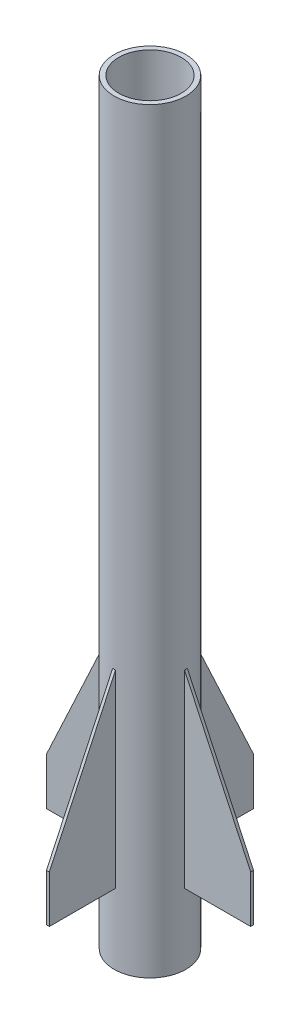
ISO-10303-21;
HEADER;
FILE_DESCRIPTION(('STEP AP214'),'2;1');
FILE_NAME('part.step','',(''),(''),'','','');
FILE_SCHEMA(('AUTOMOTIVE_DESIGN { 1 0 10303 214 1 1 1 1 }'));
ENDSEC;
DATA;
#1=APPLICATION_CONTEXT('core data for automotive mechanical design processes');
#2=APPLICATION_PROTOCOL_DEFINITION('international standard','automotive_design',2000,#1);
#3=PRODUCT_CONTEXT('',#1,'mechanical');
#4=PRODUCT('Part','Part','',(#3));
#5=PRODUCT_RELATED_PRODUCT_CATEGORY('part','',(#4));
#6=PRODUCT_DEFINITION_FORMATION('','',#4);
#7=PRODUCT_DEFINITION_CONTEXT('part definition',#1,'design');
#8=PRODUCT_DEFINITION('design','',#6,#7);
#9=PRODUCT_DEFINITION_SHAPE('','',#8);
#10=(LENGTH_UNIT() NAMED_UNIT(*) SI_UNIT(.MILLI.,.METRE.));
#11=(NAMED_UNIT(*) PLANE_ANGLE_UNIT() SI_UNIT($,.RADIAN.));
#12=(NAMED_UNIT(*) SI_UNIT($,.STERADIAN.) SOLID_ANGLE_UNIT());
#13=UNCERTAINTY_MEASURE_WITH_UNIT(LENGTH_MEASURE(1.E-05),#10,'distance_accuracy_value','');
#14=(GEOMETRIC_REPRESENTATION_CONTEXT(3) GLOBAL_UNCERTAINTY_ASSIGNED_CONTEXT((#13)) GLOBAL_UNIT_ASSIGNED_CONTEXT((#10,
#11,#12)) REPRESENTATION_CONTEXT('',''));
#15=CARTESIAN_POINT('',(0.,0.,0.));
#16=DIRECTION('',(0.,0.,1.));
#17=DIRECTION('',(1.,0.,0.));
#18=AXIS2_PLACEMENT_3D('',#15,#16,#17);
#19=CARTESIAN_POINT('',(2.99999999999774,150.,-216.));
#20=DIRECTION('',(0.,0.,1.));
#21=DIRECTION('',(1.,0.,0.));
#22=AXIS2_PLACEMENT_3D('',#19,#20,#21);
#23=PLANE('',#22);
#24=DIRECTION('',(-1.,0.,0.));
#25=VECTOR('',#24,1.);
#26=CARTESIAN_POINT('',(2.99999999999774,150.,-216.));
#27=LINE('',#26,#25);
#28=CARTESIAN_POINT('',(2.99999999999774,150.,-216.));
#29=VERTEX_POINT('',#28);
#30=CARTESIAN_POINT('',(-3.00000000000226,150.,-216.));
#31=VERTEX_POINT('',#30);
#32=EDGE_CURVE('E107',#29,#31,#27,.T.);
#33=ORIENTED_EDGE('',*,*,#32,.T.);
#34=DIRECTION('',(0.,1.,0.));
#35=VECTOR('',#34,1.);
#36=CARTESIAN_POINT('',(-3.00000000000226,150.,-216.));
#37=LINE('',#36,#35);
#38=CARTESIAN_POINT('',(-3.00000000000226,250.,-216.));
#39=VERTEX_POINT('',#38);
#40=EDGE_CURVE('E102',#31,#39,#37,.T.);
#41=ORIENTED_EDGE('',*,*,#40,.T.);
#42=DIRECTION('',(-1.,0.,0.));
#43=VECTOR('',#42,1.);
#44=CARTESIAN_POINT('',(2.99999999999774,250.,-216.));
#45=LINE('',#44,#43);
#46=CARTESIAN_POINT('',(2.99999999999774,250.,-216.));
#47=VERTEX_POINT('',#46);
#48=EDGE_CURVE('E12',#47,#39,#45,.T.);
#49=ORIENTED_EDGE('',*,*,#48,.F.);
#50=DIRECTION('',(0.,1.,0.));
#51=VECTOR('',#50,1.);
#52=CARTESIAN_POINT('',(2.99999999999774,150.,-216.));
#53=LINE('',#52,#51);
#54=EDGE_CURVE('E113',#29,#47,#53,.T.);
#55=ORIENTED_EDGE('',*,*,#54,.F.);
#56=EDGE_LOOP('',(#33,#41,#49,#55));
#57=FACE_BOUND('',#56,.T.);
#58=ADVANCED_FACE('F50',(#57),#23,.F.);
#59=CARTESIAN_POINT('',(2.99999999999774,250.,-216.));
#60=DIRECTION('',(0.,-0.422885465331124,0.906183139995265));
#61=DIRECTION('',(0.,0.906183139995265,0.422885465331124));
#62=AXIS2_PLACEMENT_3D('',#59,#60,#61);
#63=PLANE('',#62);
#64=ORIENTED_EDGE('',*,*,#48,.T.);
#65=DIRECTION('',(0.,0.906183139995265,0.422885465331124));
#66=VECTOR('',#65,1.);
#67=CARTESIAN_POINT('',(-3.00000000000226,250.,-216.));
#68=LINE('',#67,#66);
#69=CARTESIAN_POINT('',(-3.0000000000008,550.,-76.));
#70=VERTEX_POINT('',#69);
#71=EDGE_CURVE('E92',#39,#70,#68,.T.);
#72=ORIENTED_EDGE('',*,*,#71,.T.);
#73=DIRECTION('',(-1.,0.,0.));
#74=VECTOR('',#73,1.);
#75=CARTESIAN_POINT('',(2.9999999999992,550.,-76.));
#76=LINE('',#75,#74);
#77=CARTESIAN_POINT('',(2.9999999999992,550.,-76.));
#78=VERTEX_POINT('',#77);
#79=EDGE_CURVE('E57',#78,#70,#76,.T.);
#80=ORIENTED_EDGE('',*,*,#79,.F.);
#81=DIRECTION('',(0.,0.906183139995265,0.422885465331124));
#82=VECTOR('',#81,1.);
#83=CARTESIAN_POINT('',(2.99999999999774,250.,-216.));
#84=LINE('',#83,#82);
#85=EDGE_CURVE('E93',#47,#78,#84,.T.);
#86=ORIENTED_EDGE('',*,*,#85,.F.);
#87=EDGE_LOOP('',(#64,#72,#80,#86));
#88=FACE_BOUND('',#87,.T.);
#89=ADVANCED_FACE('F90',(#88),#63,.F.);
#90=CARTESIAN_POINT('',(2.9999999999992,550.,-76.));
#91=DIRECTION('',(0.,0.,-1.));
#92=DIRECTION('',(-1.,0.,0.));
#93=AXIS2_PLACEMENT_3D('',#90,#91,#92);
#94=PLANE('',#93);
#95=ORIENTED_EDGE('',*,*,#79,.T.);
#96=DIRECTION('',(0.,-1.,0.));
#97=VECTOR('',#96,1.);
#98=CARTESIAN_POINT('',(-3.0000000000008,550.,-76.));
#99=LINE('',#98,#97);
#100=CARTESIAN_POINT('',(-3.0000000000008,150.,-76.));
#101=VERTEX_POINT('',#100);
#102=EDGE_CURVE('E105',#70,#101,#99,.T.);
#103=ORIENTED_EDGE('',*,*,#102,.T.);
#104=DIRECTION('',(-1.,0.,0.));
#105=VECTOR('',#104,1.);
#106=CARTESIAN_POINT('',(2.9999999999992,150.,-76.));
#107=LINE('',#106,#105);
#108=CARTESIAN_POINT('',(2.9999999999992,150.,-76.));
#109=VERTEX_POINT('',#108);
#110=EDGE_CURVE('E119',#109,#101,#107,.T.);
#111=ORIENTED_EDGE('',*,*,#110,.F.);
#112=DIRECTION('',(0.,-1.,0.));
#113=VECTOR('',#112,1.);
#114=CARTESIAN_POINT('',(2.9999999999992,550.,-76.));
#115=LINE('',#114,#113);
#116=EDGE_CURVE('E69',#78,#109,#115,.T.);
#117=ORIENTED_EDGE('',*,*,#116,.F.);
#118=EDGE_LOOP('',(#95,#103,#111,#117));
#119=FACE_BOUND('',#118,.T.);
#120=ADVANCED_FACE('F121',(#119),#94,.F.);
#121=CARTESIAN_POINT('',(2.9999999999992,150.,-76.));
#122=DIRECTION('',(0.,1.,0.));
#123=DIRECTION('',(0.,0.,-1.));
#124=AXIS2_PLACEMENT_3D('',#121,#122,#123);
#125=PLANE('',#124);
#126=ORIENTED_EDGE('',*,*,#110,.T.);
#127=DIRECTION('',(0.,0.,-1.));
#128=VECTOR('',#127,1.);
#129=CARTESIAN_POINT('',(-3.0000000000008,150.,-76.));
#130=LINE('',#129,#128);
#131=EDGE_CURVE('E111',#101,#31,#130,.T.);
#132=ORIENTED_EDGE('',*,*,#131,.T.);
#133=ORIENTED_EDGE('',*,*,#32,.F.);
#134=DIRECTION('',(0.,0.,-1.));
#135=VECTOR('',#134,1.);
#136=CARTESIAN_POINT('',(2.9999999999992,150.,-76.));
#137=LINE('',#136,#135);
#138=EDGE_CURVE('E64',#109,#29,#137,.T.);
#139=ORIENTED_EDGE('',*,*,#138,.F.);
#140=EDGE_LOOP('',(#126,#132,#133,#139));
#141=FACE_BOUND('',#140,.T.);
#142=ADVANCED_FACE('F123',(#141),#125,.F.);
#143=CARTESIAN_POINT('',(3.,0.,0.));
#144=DIRECTION('',(-1.,0.,0.));
#145=DIRECTION('',(0.,0.,1.));
#146=AXIS2_PLACEMENT_3D('',#143,#144,#145);
#147=PLANE('',#146);
#148=ORIENTED_EDGE('',*,*,#54,.T.);
#149=ORIENTED_EDGE('',*,*,#85,.T.);
#150=ORIENTED_EDGE('',*,*,#116,.T.);
#151=ORIENTED_EDGE('',*,*,#138,.T.);
#152=EDGE_LOOP('',(#148,#149,#150,#151));
#153=FACE_BOUND('',#152,.T.);
#154=ADVANCED_FACE('F124',(#153),#147,.F.);
#155=CARTESIAN_POINT('',(-3.,0.,0.));
#156=DIRECTION('',(-1.,0.,0.));
#157=DIRECTION('',(0.,0.,1.));
#158=AXIS2_PLACEMENT_3D('',#155,#156,#157);
#159=PLANE('',#158);
#160=ORIENTED_EDGE('',*,*,#40,.F.);
#161=ORIENTED_EDGE('',*,*,#131,.F.);
#162=ORIENTED_EDGE('',*,*,#102,.F.);
#163=ORIENTED_EDGE('',*,*,#71,.F.);
#164=EDGE_LOOP('',(#160,#161,#162,#163));
#165=FACE_BOUND('',#164,.T.);
#166=ADVANCED_FACE('F100',(#165),#159,.T.);
#167=CLOSED_SHELL('',(#58,#89,#120,#142,#154,#166));
#168=MANIFOLD_SOLID_BREP('B2',#167);
#169=CARTESIAN_POINT('',(216.,150.,3.));
#170=DIRECTION('',(-1.,0.,0.));
#171=DIRECTION('',(0.,0.,1.));
#172=AXIS2_PLACEMENT_3D('',#169,#170,#171);
#173=PLANE('',#172);
#174=DIRECTION('',(0.,0.,-1.));
#175=VECTOR('',#174,1.);
#176=CARTESIAN_POINT('',(216.,150.,3.));
#177=LINE('',#176,#175);
#178=CARTESIAN_POINT('',(216.,150.,3.));
#179=VERTEX_POINT('',#178);
#180=CARTESIAN_POINT('',(216.,150.,-3.));
#181=VERTEX_POINT('',#180);
#182=EDGE_CURVE('E241',#179,#181,#177,.T.);
#183=ORIENTED_EDGE('',*,*,#182,.T.);
#184=DIRECTION('',(0.,1.,0.));
#185=VECTOR('',#184,1.);
#186=CARTESIAN_POINT('',(216.,150.,-3.));
#187=LINE('',#186,#185);
#188=CARTESIAN_POINT('',(216.,250.,-3.));
#189=VERTEX_POINT('',#188);
#190=EDGE_CURVE('E236',#181,#189,#187,.T.);
#191=ORIENTED_EDGE('',*,*,#190,.T.);
#192=DIRECTION('',(0.,0.,-1.));
#193=VECTOR('',#192,1.);
#194=CARTESIAN_POINT('',(216.,250.,3.));
#195=LINE('',#194,#193);
#196=CARTESIAN_POINT('',(216.,250.,3.));
#197=VERTEX_POINT('',#196);
#198=EDGE_CURVE('E48',#197,#189,#195,.T.);
#199=ORIENTED_EDGE('',*,*,#198,.F.);
#200=DIRECTION('',(0.,1.,0.));
#201=VECTOR('',#200,1.);
#202=CARTESIAN_POINT('',(216.,150.,3.));
#203=LINE('',#202,#201);
#204=EDGE_CURVE('E247',#179,#197,#203,.T.);
#205=ORIENTED_EDGE('',*,*,#204,.F.);
#206=EDGE_LOOP('',(#183,#191,#199,#205));
#207=FACE_BOUND('',#206,.T.);
#208=ADVANCED_FACE('F184',(#207),#173,.F.);
#209=CARTESIAN_POINT('',(216.,250.,3.));
#210=DIRECTION('',(-0.906183139995265,-0.422885465331124,0.));
#211=DIRECTION('',(-0.422885465331124,0.906183139995265,0.));
#212=AXIS2_PLACEMENT_3D('',#209,#210,#211);
#213=PLANE('',#212);
#214=ORIENTED_EDGE('',*,*,#198,.T.);
#215=DIRECTION('',(-0.422885465331124,0.906183139995265,0.));
#216=VECTOR('',#215,1.);
#217=CARTESIAN_POINT('',(216.,250.,-3.));
#218=LINE('',#217,#216);
#219=CARTESIAN_POINT('',(76.,550.,-3.));
#220=VERTEX_POINT('',#219);
#221=EDGE_CURVE('E226',#189,#220,#218,.T.);
#222=ORIENTED_EDGE('',*,*,#221,.T.);
#223=DIRECTION('',(0.,0.,-1.));
#224=VECTOR('',#223,1.);
#225=CARTESIAN_POINT('',(76.,550.,3.));
#226=LINE('',#225,#224);
#227=CARTESIAN_POINT('',(76.,550.,3.));
#228=VERTEX_POINT('',#227);
#229=EDGE_CURVE('E191',#228,#220,#226,.T.);
#230=ORIENTED_EDGE('',*,*,#229,.F.);
#231=DIRECTION('',(-0.422885465331124,0.906183139995265,0.));
#232=VECTOR('',#231,1.);
#233=CARTESIAN_POINT('',(216.,250.,3.));
#234=LINE('',#233,#232);
#235=EDGE_CURVE('E227',#197,#228,#234,.T.);
#236=ORIENTED_EDGE('',*,*,#235,.F.);
#237=EDGE_LOOP('',(#214,#222,#230,#236));
#238=FACE_BOUND('',#237,.T.);
#239=ADVANCED_FACE('F224',(#238),#213,.F.);
#240=CARTESIAN_POINT('',(76.,550.,3.));
#241=DIRECTION('',(1.,0.,0.));
#242=DIRECTION('',(0.,0.,-1.));
#243=AXIS2_PLACEMENT_3D('',#240,#241,#242);
#244=PLANE('',#243);
#245=ORIENTED_EDGE('',*,*,#229,.T.);
#246=DIRECTION('',(0.,-1.,0.));
#247=VECTOR('',#246,1.);
#248=CARTESIAN_POINT('',(76.,550.,-3.));
#249=LINE('',#248,#247);
#250=CARTESIAN_POINT('',(76.,150.,-3.));
#251=VERTEX_POINT('',#250);
#252=EDGE_CURVE('E239',#220,#251,#249,.T.);
#253=ORIENTED_EDGE('',*,*,#252,.T.);
#254=DIRECTION('',(0.,0.,-1.));
#255=VECTOR('',#254,1.);
#256=CARTESIAN_POINT('',(76.,150.,3.));
#257=LINE('',#256,#255);
#258=CARTESIAN_POINT('',(76.,150.,3.));
#259=VERTEX_POINT('',#258);
#260=EDGE_CURVE('E253',#259,#251,#257,.T.);
#261=ORIENTED_EDGE('',*,*,#260,.F.);
#262=DIRECTION('',(0.,-1.,0.));
#263=VECTOR('',#262,1.);
#264=CARTESIAN_POINT('',(76.,550.,3.));
#265=LINE('',#264,#263);
#266=EDGE_CURVE('E203',#228,#259,#265,.T.);
#267=ORIENTED_EDGE('',*,*,#266,.F.);
#268=EDGE_LOOP('',(#245,#253,#261,#267));
#269=FACE_BOUND('',#268,.T.);
#270=ADVANCED_FACE('F255',(#269),#244,.F.);
#271=CARTESIAN_POINT('',(76.,150.,3.));
#272=DIRECTION('',(0.,1.,0.));
#273=DIRECTION('',(1.,0.,0.));
#274=AXIS2_PLACEMENT_3D('',#271,#272,#273);
#275=PLANE('',#274);
#276=ORIENTED_EDGE('',*,*,#260,.T.);
#277=DIRECTION('',(1.,0.,0.));
#278=VECTOR('',#277,1.);
#279=CARTESIAN_POINT('',(76.,150.,-3.));
#280=LINE('',#279,#278);
#281=EDGE_CURVE('E245',#251,#181,#280,.T.);
#282=ORIENTED_EDGE('',*,*,#281,.T.);
#283=ORIENTED_EDGE('',*,*,#182,.F.);
#284=DIRECTION('',(1.,0.,0.));
#285=VECTOR('',#284,1.);
#286=CARTESIAN_POINT('',(76.,150.,3.));
#287=LINE('',#286,#285);
#288=EDGE_CURVE('E198',#259,#179,#287,.T.);
#289=ORIENTED_EDGE('',*,*,#288,.F.);
#290=EDGE_LOOP('',(#276,#282,#283,#289));
#291=FACE_BOUND('',#290,.T.);
#292=ADVANCED_FACE('F257',(#291),#275,.F.);
#293=CARTESIAN_POINT('',(0.,0.,3.));
#294=DIRECTION('',(0.,0.,-1.));
#295=DIRECTION('',(-1.,0.,0.));
#296=AXIS2_PLACEMENT_3D('',#293,#294,#295);
#297=PLANE('',#296);
#298=ORIENTED_EDGE('',*,*,#204,.T.);
#299=ORIENTED_EDGE('',*,*,#235,.T.);
#300=ORIENTED_EDGE('',*,*,#266,.T.);
#301=ORIENTED_EDGE('',*,*,#288,.T.);
#302=EDGE_LOOP('',(#298,#299,#300,#301));
#303=FACE_BOUND('',#302,.T.);
#304=ADVANCED_FACE('F258',(#303),#297,.F.);
#305=CARTESIAN_POINT('',(0.,0.,-3.));
#306=DIRECTION('',(0.,0.,-1.));
#307=DIRECTION('',(-1.,0.,0.));
#308=AXIS2_PLACEMENT_3D('',#305,#306,#307);
#309=PLANE('',#308);
#310=ORIENTED_EDGE('',*,*,#190,.F.);
#311=ORIENTED_EDGE('',*,*,#281,.F.);
#312=ORIENTED_EDGE('',*,*,#252,.F.);
#313=ORIENTED_EDGE('',*,*,#221,.F.);
#314=EDGE_LOOP('',(#310,#311,#312,#313));
#315=FACE_BOUND('',#314,.T.);
#316=ADVANCED_FACE('F234',(#315),#309,.T.);
#317=CLOSED_SHELL('',(#208,#239,#270,#292,#304,#316));
#318=MANIFOLD_SOLID_BREP('B6',#317);
#319=CARTESIAN_POINT('',(-2.99999999999925,150.,216.));
#320=DIRECTION('',(0.,0.,-1.));
#321=DIRECTION('',(-1.,0.,0.));
#322=AXIS2_PLACEMENT_3D('',#319,#320,#321);
#323=PLANE('',#322);
#324=DIRECTION('',(1.,0.,0.));
#325=VECTOR('',#324,1.);
#326=CARTESIAN_POINT('',(-2.99999999999925,150.,216.));
#327=LINE('',#326,#325);
#328=CARTESIAN_POINT('',(-2.99999999999925,150.,216.));
#329=VERTEX_POINT('',#328);
#330=CARTESIAN_POINT('',(3.00000000000075,150.,216.));
#331=VERTEX_POINT('',#330);
#332=EDGE_CURVE('E375',#329,#331,#327,.T.);
#333=ORIENTED_EDGE('',*,*,#332,.T.);
#334=DIRECTION('',(0.,1.,0.));
#335=VECTOR('',#334,1.);
#336=CARTESIAN_POINT('',(3.00000000000075,150.,216.));
#337=LINE('',#336,#335);
#338=CARTESIAN_POINT('',(3.00000000000075,250.,216.));
#339=VERTEX_POINT('',#338);
#340=EDGE_CURVE('E370',#331,#339,#337,.T.);
#341=ORIENTED_EDGE('',*,*,#340,.T.);
#342=DIRECTION('',(1.,0.,0.));
#343=VECTOR('',#342,1.);
#344=CARTESIAN_POINT('',(-2.99999999999925,250.,216.));
#345=LINE('',#344,#343);
#346=CARTESIAN_POINT('',(-2.99999999999925,250.,216.));
#347=VERTEX_POINT('',#346);
#348=EDGE_CURVE('E182',#347,#339,#345,.T.);
#349=ORIENTED_EDGE('',*,*,#348,.F.);
#350=DIRECTION('',(0.,1.,0.));
#351=VECTOR('',#350,1.);
#352=CARTESIAN_POINT('',(-2.99999999999925,150.,216.));
#353=LINE('',#352,#351);
#354=EDGE_CURVE('E381',#329,#347,#353,.T.);
#355=ORIENTED_EDGE('',*,*,#354,.F.);
#356=EDGE_LOOP('',(#333,#341,#349,#355));
#357=FACE_BOUND('',#356,.T.);
#358=ADVANCED_FACE('F318',(#357),#323,.F.);
#359=CARTESIAN_POINT('',(-2.99999999999925,250.,216.));
#360=DIRECTION('',(0.,-0.422885465331124,-0.906183139995265));
#361=DIRECTION('',(0.,0.906183139995265,-0.422885465331124));
#362=AXIS2_PLACEMENT_3D('',#359,#360,#361);
#363=PLANE('',#362);
#364=ORIENTED_EDGE('',*,*,#348,.T.);
#365=DIRECTION('',(0.,0.906183139995265,-0.422885465331124));
#366=VECTOR('',#365,1.);
#367=CARTESIAN_POINT('',(3.00000000000075,250.,216.));
#368=LINE('',#367,#366);
#369=CARTESIAN_POINT('',(3.00000000000027,550.,76.));
#370=VERTEX_POINT('',#369);
#371=EDGE_CURVE('E360',#339,#370,#368,.T.);
#372=ORIENTED_EDGE('',*,*,#371,.T.);
#373=DIRECTION('',(1.,0.,0.));
#374=VECTOR('',#373,1.);
#375=CARTESIAN_POINT('',(-2.99999999999973,550.,76.));
#376=LINE('',#375,#374);
#377=CARTESIAN_POINT('',(-2.99999999999973,550.,76.));
#378=VERTEX_POINT('',#377);
#379=EDGE_CURVE('E325',#378,#370,#376,.T.);
#380=ORIENTED_EDGE('',*,*,#379,.F.);
#381=DIRECTION('',(0.,0.906183139995265,-0.422885465331124));
#382=VECTOR('',#381,1.);
#383=CARTESIAN_POINT('',(-2.99999999999925,250.,216.));
#384=LINE('',#383,#382);
#385=EDGE_CURVE('E361',#347,#378,#384,.T.);
#386=ORIENTED_EDGE('',*,*,#385,.F.);
#387=EDGE_LOOP('',(#364,#372,#380,#386));
#388=FACE_BOUND('',#387,.T.);
#389=ADVANCED_FACE('F358',(#388),#363,.F.);
#390=CARTESIAN_POINT('',(-2.99999999999973,550.,76.));
#391=DIRECTION('',(0.,0.,1.));
#392=DIRECTION('',(1.,0.,0.));
#393=AXIS2_PLACEMENT_3D('',#390,#391,#392);
#394=PLANE('',#393);
#395=ORIENTED_EDGE('',*,*,#379,.T.);
#396=DIRECTION('',(0.,-1.,0.));
#397=VECTOR('',#396,1.);
#398=CARTESIAN_POINT('',(3.00000000000027,550.,76.));
#399=LINE('',#398,#397);
#400=CARTESIAN_POINT('',(3.00000000000027,150.,76.));
#401=VERTEX_POINT('',#400);
#402=EDGE_CURVE('E373',#370,#401,#399,.T.);
#403=ORIENTED_EDGE('',*,*,#402,.T.);
#404=DIRECTION('',(1.,0.,0.));
#405=VECTOR('',#404,1.);
#406=CARTESIAN_POINT('',(-2.99999999999973,150.,76.));
#407=LINE('',#406,#405);
#408=CARTESIAN_POINT('',(-2.99999999999973,150.,76.));
#409=VERTEX_POINT('',#408);
#410=EDGE_CURVE('E387',#409,#401,#407,.T.);
#411=ORIENTED_EDGE('',*,*,#410,.F.);
#412=DIRECTION('',(0.,-1.,0.));
#413=VECTOR('',#412,1.);
#414=CARTESIAN_POINT('',(-2.99999999999973,550.,76.));
#415=LINE('',#414,#413);
#416=EDGE_CURVE('E337',#378,#409,#415,.T.);
#417=ORIENTED_EDGE('',*,*,#416,.F.);
#418=EDGE_LOOP('',(#395,#403,#411,#417));
#419=FACE_BOUND('',#418,.T.);
#420=ADVANCED_FACE('F389',(#419),#394,.F.);
#421=CARTESIAN_POINT('',(-2.99999999999973,150.,76.));
#422=DIRECTION('',(0.,1.,0.));
#423=DIRECTION('',(0.,0.,1.));
#424=AXIS2_PLACEMENT_3D('',#421,#422,#423);
#425=PLANE('',#424);
#426=ORIENTED_EDGE('',*,*,#410,.T.);
#427=DIRECTION('',(0.,0.,1.));
#428=VECTOR('',#427,1.);
#429=CARTESIAN_POINT('',(3.00000000000027,150.,76.));
#430=LINE('',#429,#428);
#431=EDGE_CURVE('E379',#401,#331,#430,.T.);
#432=ORIENTED_EDGE('',*,*,#431,.T.);
#433=ORIENTED_EDGE('',*,*,#332,.F.);
#434=DIRECTION('',(0.,0.,1.));
#435=VECTOR('',#434,1.);
#436=CARTESIAN_POINT('',(-2.99999999999973,150.,76.));
#437=LINE('',#436,#435);
#438=EDGE_CURVE('E332',#409,#329,#437,.T.);
#439=ORIENTED_EDGE('',*,*,#438,.F.);
#440=EDGE_LOOP('',(#426,#432,#433,#439));
#441=FACE_BOUND('',#440,.T.);
#442=ADVANCED_FACE('F391',(#441),#425,.F.);
#443=CARTESIAN_POINT('',(-3.,0.,0.));
#444=DIRECTION('',(1.,0.,0.));
#445=DIRECTION('',(0.,0.,-1.));
#446=AXIS2_PLACEMENT_3D('',#443,#444,#445);
#447=PLANE('',#446);
#448=ORIENTED_EDGE('',*,*,#354,.T.);
#449=ORIENTED_EDGE('',*,*,#385,.T.);
#450=ORIENTED_EDGE('',*,*,#416,.T.);
#451=ORIENTED_EDGE('',*,*,#438,.T.);
#452=EDGE_LOOP('',(#448,#449,#450,#451));
#453=FACE_BOUND('',#452,.T.);
#454=ADVANCED_FACE('F392',(#453),#447,.F.);
#455=CARTESIAN_POINT('',(3.,0.,0.));
#456=DIRECTION('',(1.,0.,0.));
#457=DIRECTION('',(0.,0.,-1.));
#458=AXIS2_PLACEMENT_3D('',#455,#456,#457);
#459=PLANE('',#458);
#460=ORIENTED_EDGE('',*,*,#340,.F.);
#461=ORIENTED_EDGE('',*,*,#431,.F.);
#462=ORIENTED_EDGE('',*,*,#402,.F.);
#463=ORIENTED_EDGE('',*,*,#371,.F.);
#464=EDGE_LOOP('',(#460,#461,#462,#463));
#465=FACE_BOUND('',#464,.T.);
#466=ADVANCED_FACE('F368',(#465),#459,.T.);
#467=CLOSED_SHELL('',(#358,#389,#420,#442,#454,#466));
#468=MANIFOLD_SOLID_BREP('B42',#467);
#469=CARTESIAN_POINT('',(-216.,150.,-3.));
#470=DIRECTION('',(1.,0.,0.));
#471=DIRECTION('',(0.,0.,-1.));
#472=AXIS2_PLACEMENT_3D('',#469,#470,#471);
#473=PLANE('',#472);
#474=DIRECTION('',(0.,0.,1.));
#475=VECTOR('',#474,1.);
#476=CARTESIAN_POINT('',(-216.,150.,-3.));
#477=LINE('',#476,#475);
#478=CARTESIAN_POINT('',(-216.,150.,-3.));
#479=VERTEX_POINT('',#478);
#480=CARTESIAN_POINT('',(-216.,150.,3.));
#481=VERTEX_POINT('',#480);
#482=EDGE_CURVE('E506',#479,#481,#477,.T.);
#483=ORIENTED_EDGE('',*,*,#482,.T.);
#484=DIRECTION('',(0.,1.,0.));
#485=VECTOR('',#484,1.);
#486=CARTESIAN_POINT('',(-216.,150.,3.));
#487=LINE('',#486,#485);
#488=CARTESIAN_POINT('',(-216.,250.,3.));
#489=VERTEX_POINT('',#488);
#490=EDGE_CURVE('E501',#481,#489,#487,.T.);
#491=ORIENTED_EDGE('',*,*,#490,.T.);
#492=DIRECTION('',(0.,0.,1.));
#493=VECTOR('',#492,1.);
#494=CARTESIAN_POINT('',(-216.,250.,-3.));
#495=LINE('',#494,#493);
#496=CARTESIAN_POINT('',(-216.,250.,-3.));
#497=VERTEX_POINT('',#496);
#498=EDGE_CURVE('E316',#497,#489,#495,.T.);
#499=ORIENTED_EDGE('',*,*,#498,.F.);
#500=DIRECTION('',(0.,1.,0.));
#501=VECTOR('',#500,1.);
#502=CARTESIAN_POINT('',(-216.,150.,-3.));
#503=LINE('',#502,#501);
#504=EDGE_CURVE('E512',#479,#497,#503,.T.);
#505=ORIENTED_EDGE('',*,*,#504,.F.);
#506=EDGE_LOOP('',(#483,#491,#499,#505));
#507=FACE_BOUND('',#506,.T.);
#508=ADVANCED_FACE('F449',(#507),#473,.F.);
#509=CARTESIAN_POINT('',(-216.,250.,-3.));
#510=DIRECTION('',(0.906183139995265,-0.422885465331124,0.));
#511=DIRECTION('',(0.422885465331124,0.906183139995265,0.));
#512=AXIS2_PLACEMENT_3D('',#509,#510,#511);
#513=PLANE('',#512);
#514=ORIENTED_EDGE('',*,*,#498,.T.);
#515=DIRECTION('',(0.422885465331124,0.906183139995265,0.));
#516=VECTOR('',#515,1.);
#517=CARTESIAN_POINT('',(-216.,250.,3.));
#518=LINE('',#517,#516);
#519=CARTESIAN_POINT('',(-76.,550.,3.));
#520=VERTEX_POINT('',#519);
#521=EDGE_CURVE('E491',#489,#520,#518,.T.);
#522=ORIENTED_EDGE('',*,*,#521,.T.);
#523=DIRECTION('',(0.,0.,1.));
#524=VECTOR('',#523,1.);
#525=CARTESIAN_POINT('',(-76.,550.,-3.));
#526=LINE('',#525,#524);
#527=CARTESIAN_POINT('',(-76.,550.,-3.));
#528=VERTEX_POINT('',#527);
#529=EDGE_CURVE('E456',#528,#520,#526,.T.);
#530=ORIENTED_EDGE('',*,*,#529,.F.);
#531=DIRECTION('',(0.422885465331124,0.906183139995265,0.));
#532=VECTOR('',#531,1.);
#533=CARTESIAN_POINT('',(-216.,250.,-3.));
#534=LINE('',#533,#532);
#535=EDGE_CURVE('E492',#497,#528,#534,.T.);
#536=ORIENTED_EDGE('',*,*,#535,.F.);
#537=EDGE_LOOP('',(#514,#522,#530,#536));
#538=FACE_BOUND('',#537,.T.);
#539=ADVANCED_FACE('F489',(#538),#513,.F.);
#540=CARTESIAN_POINT('',(-76.,550.,-3.));
#541=DIRECTION('',(-1.,0.,0.));
#542=DIRECTION('',(0.,0.,1.));
#543=AXIS2_PLACEMENT_3D('',#540,#541,#542);
#544=PLANE('',#543);
#545=ORIENTED_EDGE('',*,*,#529,.T.);
#546=DIRECTION('',(0.,-1.,0.));
#547=VECTOR('',#546,1.);
#548=CARTESIAN_POINT('',(-76.,550.,3.));
#549=LINE('',#548,#547);
#550=CARTESIAN_POINT('',(-76.,150.,3.));
#551=VERTEX_POINT('',#550);
#552=EDGE_CURVE('E504',#520,#551,#549,.T.);
#553=ORIENTED_EDGE('',*,*,#552,.T.);
#554=DIRECTION('',(0.,0.,1.));
#555=VECTOR('',#554,1.);
#556=CARTESIAN_POINT('',(-76.,150.,-3.));
#557=LINE('',#556,#555);
#558=CARTESIAN_POINT('',(-76.,150.,-3.));
#559=VERTEX_POINT('',#558);
#560=EDGE_CURVE('E518',#559,#551,#557,.T.);
#561=ORIENTED_EDGE('',*,*,#560,.F.);
#562=DIRECTION('',(0.,-1.,0.));
#563=VECTOR('',#562,1.);
#564=CARTESIAN_POINT('',(-76.,550.,-3.));
#565=LINE('',#564,#563);
#566=EDGE_CURVE('E468',#528,#559,#565,.T.);
#567=ORIENTED_EDGE('',*,*,#566,.F.);
#568=EDGE_LOOP('',(#545,#553,#561,#567));
#569=FACE_BOUND('',#568,.T.);
#570=ADVANCED_FACE('F520',(#569),#544,.F.);
#571=CARTESIAN_POINT('',(-76.,150.,-3.));
#572=DIRECTION('',(0.,1.,0.));
#573=DIRECTION('',(-1.,0.,0.));
#574=AXIS2_PLACEMENT_3D('',#571,#572,#573);
#575=PLANE('',#574);
#576=ORIENTED_EDGE('',*,*,#560,.T.);
#577=DIRECTION('',(-1.,0.,0.));
#578=VECTOR('',#577,1.);
#579=CARTESIAN_POINT('',(-76.,150.,3.));
#580=LINE('',#579,#578);
#581=EDGE_CURVE('E510',#551,#481,#580,.T.);
#582=ORIENTED_EDGE('',*,*,#581,.T.);
#583=ORIENTED_EDGE('',*,*,#482,.F.);
#584=DIRECTION('',(-1.,0.,0.));
#585=VECTOR('',#584,1.);
#586=CARTESIAN_POINT('',(-76.,150.,-3.));
#587=LINE('',#586,#585);
#588=EDGE_CURVE('E463',#559,#479,#587,.T.);
#589=ORIENTED_EDGE('',*,*,#588,.F.);
#590=EDGE_LOOP('',(#576,#582,#583,#589));
#591=FACE_BOUND('',#590,.T.);
#592=ADVANCED_FACE('F522',(#591),#575,.F.);
#593=CARTESIAN_POINT('',(0.,0.,-3.));
#594=DIRECTION('',(0.,0.,1.));
#595=DIRECTION('',(1.,0.,0.));
#596=AXIS2_PLACEMENT_3D('',#593,#594,#595);
#597=PLANE('',#596);
#598=ORIENTED_EDGE('',*,*,#504,.T.);
#599=ORIENTED_EDGE('',*,*,#535,.T.);
#600=ORIENTED_EDGE('',*,*,#566,.T.);
#601=ORIENTED_EDGE('',*,*,#588,.T.);
#602=EDGE_LOOP('',(#598,#599,#600,#601));
#603=FACE_BOUND('',#602,.T.);
#604=ADVANCED_FACE('F523',(#603),#597,.F.);
#605=CARTESIAN_POINT('',(0.,0.,3.));
#606=DIRECTION('',(0.,0.,1.));
#607=DIRECTION('',(1.,0.,0.));
#608=AXIS2_PLACEMENT_3D('',#605,#606,#607);
#609=PLANE('',#608);
#610=ORIENTED_EDGE('',*,*,#490,.F.);
#611=ORIENTED_EDGE('',*,*,#581,.F.);
#612=ORIENTED_EDGE('',*,*,#552,.F.);
#613=ORIENTED_EDGE('',*,*,#521,.F.);
#614=EDGE_LOOP('',(#610,#611,#612,#613));
#615=FACE_BOUND('',#614,.T.);
#616=ADVANCED_FACE('F499',(#615),#609,.T.);
#617=CLOSED_SHELL('',(#508,#539,#570,#592,#604,#616));
#618=MANIFOLD_SOLID_BREP('B176',#617);
#619=CARTESIAN_POINT('',(76.,0.,0.));
#620=DIRECTION('',(0.,-1.,0.));
#621=DIRECTION('',(0.,0.,-1.));
#622=AXIS2_PLACEMENT_3D('',#619,#620,#621);
#623=PLANE('',#622);
#624=CARTESIAN_POINT('',(0.,0.,0.));
#625=DIRECTION('',(0.,-1.,0.));
#626=DIRECTION('',(0.,0.,-1.));
#627=AXIS2_PLACEMENT_3D('',#624,#625,#626);
#628=CIRCLE('',#627,76.);
#629=CARTESIAN_POINT('',(0.,0.,-76.));
#630=VERTEX_POINT('',#629);
#631=EDGE_CURVE('E587',#630,#630,#628,.T.);
#632=ORIENTED_EDGE('',*,*,#631,.T.);
#633=EDGE_LOOP('',(#632));
#634=FACE_BOUND('',#633,.T.);
#635=CARTESIAN_POINT('',(0.,0.,0.));
#636=DIRECTION('',(0.,-1.,0.));
#637=DIRECTION('',(0.,0.,-1.));
#638=AXIS2_PLACEMENT_3D('',#635,#636,#637);
#639=CIRCLE('',#638,66.);
#640=CARTESIAN_POINT('',(0.,0.,-66.));
#641=VERTEX_POINT('',#640);
#642=EDGE_CURVE('E448',#641,#641,#639,.T.);
#643=ORIENTED_EDGE('',*,*,#642,.F.);
#644=EDGE_LOOP('',(#643));
#645=FACE_BOUND('',#644,.T.);
#646=ADVANCED_FACE('F573',(#634,#645),#623,.T.);
#647=CARTESIAN_POINT('',(0.,0.,0.));
#648=DIRECTION('',(0.,-1.,0.));
#649=DIRECTION('',(0.,0.,-1.));
#650=AXIS2_PLACEMENT_3D('',#647,#648,#649);
#651=CYLINDRICAL_SURFACE('',#650,66.);
#652=ORIENTED_EDGE('',*,*,#642,.T.);
#653=EDGE_LOOP('',(#652));
#654=FACE_BOUND('',#653,.T.);
#655=CARTESIAN_POINT('',(0.,1600.,0.));
#656=DIRECTION('',(0.,-1.,0.));
#657=DIRECTION('',(0.,0.,-1.));
#658=AXIS2_PLACEMENT_3D('',#655,#656,#657);
#659=CIRCLE('',#658,66.);
#660=CARTESIAN_POINT('',(0.,1600.,-66.));
#661=VERTEX_POINT('',#660);
#662=EDGE_CURVE('E579',#661,#661,#659,.T.);
#663=ORIENTED_EDGE('',*,*,#662,.F.);
#664=EDGE_LOOP('',(#663));
#665=FACE_BOUND('',#664,.T.);
#666=ADVANCED_FACE('F603',(#654,#665),#651,.F.);
#667=CARTESIAN_POINT('',(76.,1600.,0.));
#668=DIRECTION('',(0.,1.,0.));
#669=DIRECTION('',(0.,0.,1.));
#670=AXIS2_PLACEMENT_3D('',#667,#668,#669);
#671=PLANE('',#670);
#672=ORIENTED_EDGE('',*,*,#662,.T.);
#673=EDGE_LOOP('',(#672));
#674=FACE_BOUND('',#673,.T.);
#675=CARTESIAN_POINT('',(0.,1600.,0.));
#676=DIRECTION('',(0.,-1.,0.));
#677=DIRECTION('',(0.,0.,-1.));
#678=AXIS2_PLACEMENT_3D('',#675,#676,#677);
#679=CIRCLE('',#678,76.);
#680=CARTESIAN_POINT('',(0.,1600.,-76.));
#681=VERTEX_POINT('',#680);
#682=EDGE_CURVE('E583',#681,#681,#679,.T.);
#683=ORIENTED_EDGE('',*,*,#682,.F.);
#684=EDGE_LOOP('',(#683));
#685=FACE_BOUND('',#684,.T.);
#686=ADVANCED_FACE('F597',(#674,#685),#671,.T.);
#687=CARTESIAN_POINT('',(0.,0.,0.));
#688=DIRECTION('',(0.,-1.,0.));
#689=DIRECTION('',(0.,0.,-1.));
#690=AXIS2_PLACEMENT_3D('',#687,#688,#689);
#691=CYLINDRICAL_SURFACE('',#690,76.);
#692=ORIENTED_EDGE('',*,*,#682,.T.);
#693=EDGE_LOOP('',(#692));
#694=FACE_BOUND('',#693,.T.);
#695=ORIENTED_EDGE('',*,*,#631,.F.);
#696=EDGE_LOOP('',(#695));
#697=FACE_BOUND('',#696,.T.);
#698=ADVANCED_FACE('F595',(#694,#697),#691,.T.);
#699=CLOSED_SHELL('',(#646,#666,#686,#698));
#700=MANIFOLD_SOLID_BREP('B310',#699);
#701=ADVANCED_BREP_SHAPE_REPRESENTATION('',(#18,#168,#318,#468,#618,#700),#14);
#702=SHAPE_DEFINITION_REPRESENTATION(#9,#701);
ENDSEC;
END-ISO-10303-21;
